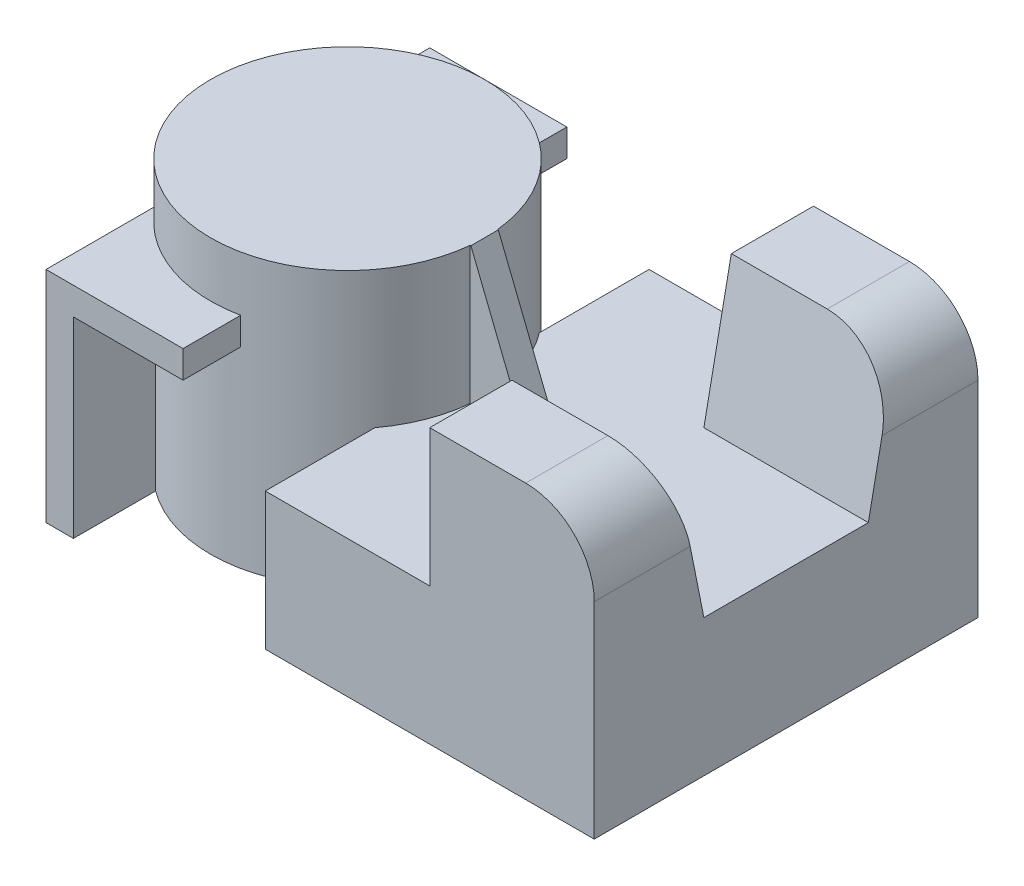
ISO-10303-21;
HEADER;
FILE_DESCRIPTION(('STEP AP214'),'2;1');
FILE_NAME('part.step','',(''),(''),'','','');
FILE_SCHEMA(('AUTOMOTIVE_DESIGN { 1 0 10303 214 1 1 1 1 }'));
ENDSEC;
DATA;
#1=APPLICATION_CONTEXT('core data for automotive mechanical design processes');
#2=APPLICATION_PROTOCOL_DEFINITION('international standard','automotive_design',2000,#1);
#3=PRODUCT_CONTEXT('',#1,'mechanical');
#4=PRODUCT('Part','Part','',(#3));
#5=PRODUCT_RELATED_PRODUCT_CATEGORY('part','',(#4));
#6=PRODUCT_DEFINITION_FORMATION('','',#4);
#7=PRODUCT_DEFINITION_CONTEXT('part definition',#1,'design');
#8=PRODUCT_DEFINITION('design','',#6,#7);
#9=PRODUCT_DEFINITION_SHAPE('','',#8);
#10=(LENGTH_UNIT() NAMED_UNIT(*) SI_UNIT(.MILLI.,.METRE.));
#11=(NAMED_UNIT(*) PLANE_ANGLE_UNIT() SI_UNIT($,.RADIAN.));
#12=(NAMED_UNIT(*) SI_UNIT($,.STERADIAN.) SOLID_ANGLE_UNIT());
#13=UNCERTAINTY_MEASURE_WITH_UNIT(LENGTH_MEASURE(1.E-05),#10,'distance_accuracy_value','');
#14=(GEOMETRIC_REPRESENTATION_CONTEXT(3) GLOBAL_UNCERTAINTY_ASSIGNED_CONTEXT((#13)) GLOBAL_UNIT_ASSIGNED_CONTEXT((#10,
#11,#12)) REPRESENTATION_CONTEXT('',''));
#15=CARTESIAN_POINT('',(0.,0.,0.));
#16=DIRECTION('',(0.,0.,1.));
#17=DIRECTION('',(1.,0.,0.));
#18=AXIS2_PLACEMENT_3D('',#15,#16,#17);
#19=CARTESIAN_POINT('',(67.5,37.5,35.));
#20=DIRECTION('',(0.,0.,-1.));
#21=DIRECTION('',(-1.,0.,0.));
#22=AXIS2_PLACEMENT_3D('',#19,#20,#21);
#23=CYLINDRICAL_SURFACE('',#22,12.5);
#24=CARTESIAN_POINT('',(67.5,37.5,17.5));
#25=DIRECTION('',(0.,0.196116135138184,-0.98058067569092));
#26=DIRECTION('',(0.,-0.98058067569092,-0.196116135138184));
#27=AXIS2_PLACEMENT_3D('',#24,#25,#26);
#28=ELLIPSE('',#27,12.747548783982,12.5);
#29=CARTESIAN_POINT('',(80.,37.5,17.5));
#30=VERTEX_POINT('',#29);
#31=CARTESIAN_POINT('',(67.5,50.,20.));
#32=VERTEX_POINT('',#31);
#33=EDGE_CURVE('E255',#30,#32,#28,.F.);
#34=ORIENTED_EDGE('',*,*,#33,.T.);
#35=DIRECTION('',(0.,0.,-1.));
#36=VECTOR('',#35,1.);
#37=CARTESIAN_POINT('',(67.5,50.,35.));
#38=LINE('',#37,#36);
#39=CARTESIAN_POINT('',(67.5,50.,35.));
#40=VERTEX_POINT('',#39);
#41=EDGE_CURVE('E269',#40,#32,#38,.T.);
#42=ORIENTED_EDGE('',*,*,#41,.F.);
#43=CARTESIAN_POINT('',(67.5,37.5,35.));
#44=DIRECTION('',(0.,0.,1.));
#45=DIRECTION('',(1.,0.,0.));
#46=AXIS2_PLACEMENT_3D('',#43,#44,#45);
#47=CIRCLE('',#46,12.5);
#48=CARTESIAN_POINT('',(80.,37.5,35.));
#49=VERTEX_POINT('',#48);
#50=EDGE_CURVE('E419',#49,#40,#47,.T.);
#51=ORIENTED_EDGE('',*,*,#50,.F.);
#52=DIRECTION('',(0.,0.,-1.));
#53=VECTOR('',#52,1.);
#54=CARTESIAN_POINT('',(80.,37.5,35.));
#55=LINE('',#54,#53);
#56=EDGE_CURVE('E273',#49,#30,#55,.T.);
#57=ORIENTED_EDGE('',*,*,#56,.T.);
#58=EDGE_LOOP('',(#34,#42,#51,#57));
#59=FACE_BOUND('',#58,.T.);
#60=ADVANCED_FACE('F37',(#59),#23,.T.);
#61=CARTESIAN_POINT('',(50.,50.,35.));
#62=DIRECTION('',(0.,-1.,0.));
#63=DIRECTION('',(1.,0.,0.));
#64=AXIS2_PLACEMENT_3D('',#61,#62,#63);
#65=PLANE('',#64);
#66=DIRECTION('',(1.,0.,0.));
#67=VECTOR('',#66,1.);
#68=CARTESIAN_POINT('',(-25.001,50.,20.));
#69=LINE('',#68,#67);
#70=CARTESIAN_POINT('',(50.,50.,20.));
#71=VERTEX_POINT('',#70);
#72=EDGE_CURVE('E559',#71,#32,#69,.T.);
#73=ORIENTED_EDGE('',*,*,#72,.F.);
#74=DIRECTION('',(0.,0.,-1.));
#75=VECTOR('',#74,1.);
#76=CARTESIAN_POINT('',(50.,50.,35.));
#77=LINE('',#76,#75);
#78=CARTESIAN_POINT('',(50.,50.,35.));
#79=VERTEX_POINT('',#78);
#80=EDGE_CURVE('E254',#79,#71,#77,.T.);
#81=ORIENTED_EDGE('',*,*,#80,.F.);
#82=DIRECTION('',(-1.,0.,0.));
#83=VECTOR('',#82,1.);
#84=CARTESIAN_POINT('',(50.,50.,35.));
#85=LINE('',#84,#83);
#86=EDGE_CURVE('E421',#40,#79,#85,.T.);
#87=ORIENTED_EDGE('',*,*,#86,.F.);
#88=ORIENTED_EDGE('',*,*,#41,.T.);
#89=EDGE_LOOP('',(#73,#81,#87,#88));
#90=FACE_BOUND('',#89,.T.);
#91=ADVANCED_FACE('F532',(#90),#65,.F.);
#92=CARTESIAN_POINT('',(50.,25.,35.));
#93=DIRECTION('',(1.,0.,0.));
#94=DIRECTION('',(0.,0.,-1.));
#95=AXIS2_PLACEMENT_3D('',#92,#93,#94);
#96=PLANE('',#95);
#97=DIRECTION('',(0.,-0.98058067569092,-0.196116135138184));
#98=VECTOR('',#97,1.);
#99=CARTESIAN_POINT('',(50.,25.,15.));
#100=LINE('',#99,#98);
#101=CARTESIAN_POINT('',(50.,25.,15.));
#102=VERTEX_POINT('',#101);
#103=EDGE_CURVE('E236',#71,#102,#100,.T.);
#104=ORIENTED_EDGE('',*,*,#103,.T.);
#105=DIRECTION('',(0.,0.,-1.));
#106=VECTOR('',#105,1.);
#107=CARTESIAN_POINT('',(50.,25.,35.));
#108=LINE('',#107,#106);
#109=CARTESIAN_POINT('',(50.,25.,35.));
#110=VERTEX_POINT('',#109);
#111=EDGE_CURVE('E251',#110,#102,#108,.T.);
#112=ORIENTED_EDGE('',*,*,#111,.F.);
#113=DIRECTION('',(0.,-1.,0.));
#114=VECTOR('',#113,1.);
#115=CARTESIAN_POINT('',(50.,25.,35.));
#116=LINE('',#115,#114);
#117=EDGE_CURVE('E423',#79,#110,#116,.T.);
#118=ORIENTED_EDGE('',*,*,#117,.F.);
#119=ORIENTED_EDGE('',*,*,#80,.T.);
#120=EDGE_LOOP('',(#104,#112,#118,#119));
#121=FACE_BOUND('',#120,.T.);
#122=ADVANCED_FACE('F249',(#121),#96,.F.);
#123=CARTESIAN_POINT('',(0.,50.,0.));
#124=DIRECTION('',(0.,-1.,0.));
#125=DIRECTION('',(0.,0.,-1.));
#126=AXIS2_PLACEMENT_3D('',#123,#124,#125);
#127=CYLINDRICAL_SURFACE('',#126,25.);
#128=DIRECTION('',(0.,-1.,0.));
#129=VECTOR('',#128,1.);
#130=CARTESIAN_POINT('',(24.8746859276655,50.,2.5));
#131=LINE('',#130,#129);
#132=CARTESIAN_POINT('',(24.8746859276655,25.,2.5));
#133=VERTEX_POINT('',#132);
#134=CARTESIAN_POINT('',(24.8746859276655,50.,2.5));
#135=VERTEX_POINT('',#134);
#136=EDGE_CURVE('E394',#133,#135,#131,.F.);
#137=ORIENTED_EDGE('',*,*,#136,.T.);
#138=CARTESIAN_POINT('',(0.,50.,0.));
#139=DIRECTION('',(0.,1.,0.));
#140=DIRECTION('',(0.,0.,1.));
#141=AXIS2_PLACEMENT_3D('',#138,#139,#140);
#142=CIRCLE('',#141,25.);
#143=CARTESIAN_POINT('',(24.8746859276655,50.,-2.5));
#144=VERTEX_POINT('',#143);
#145=EDGE_CURVE('E60',#144,#135,#142,.T.);
#146=ORIENTED_EDGE('',*,*,#145,.F.);
#147=DIRECTION('',(0.,-1.,0.));
#148=VECTOR('',#147,1.);
#149=CARTESIAN_POINT('',(24.8746859276655,50.,-2.5));
#150=LINE('',#149,#148);
#151=CARTESIAN_POINT('',(24.8746859276655,25.,-2.5));
#152=VERTEX_POINT('',#151);
#153=EDGE_CURVE('E400',#152,#144,#150,.F.);
#154=ORIENTED_EDGE('',*,*,#153,.F.);
#155=CARTESIAN_POINT('',(0.,25.,0.));
#156=DIRECTION('',(0.,-1.,0.));
#157=DIRECTION('',(0.,0.,-1.));
#158=AXIS2_PLACEMENT_3D('',#155,#156,#157);
#159=CIRCLE('',#158,25.);
#160=CARTESIAN_POINT('',(20.,25.,-15.));
#161=VERTEX_POINT('',#160);
#162=EDGE_CURVE('E377',#161,#152,#159,.T.);
#163=ORIENTED_EDGE('',*,*,#162,.F.);
#164=DIRECTION('',(0.,-1.,0.));
#165=VECTOR('',#164,1.);
#166=CARTESIAN_POINT('',(20.,50.,-15.));
#167=LINE('',#166,#165);
#168=CARTESIAN_POINT('',(20.,0.,-15.));
#169=VERTEX_POINT('',#168);
#170=EDGE_CURVE('E279',#169,#161,#167,.F.);
#171=ORIENTED_EDGE('',*,*,#170,.F.);
#172=CARTESIAN_POINT('',(0.,0.,0.));
#173=DIRECTION('',(0.,1.,0.));
#174=DIRECTION('',(0.,0.,1.));
#175=AXIS2_PLACEMENT_3D('',#172,#173,#174);
#176=CIRCLE('',#175,25.);
#177=CARTESIAN_POINT('',(-15.,0.,-20.));
#178=VERTEX_POINT('',#177);
#179=EDGE_CURVE('E376',#169,#178,#176,.T.);
#180=ORIENTED_EDGE('',*,*,#179,.T.);
#181=DIRECTION('',(0.,-1.,0.));
#182=VECTOR('',#181,1.);
#183=CARTESIAN_POINT('',(-15.,50.,-20.));
#184=LINE('',#183,#182);
#185=CARTESIAN_POINT('',(-15.,35.,-20.));
#186=VERTEX_POINT('',#185);
#187=EDGE_CURVE('E296',#178,#186,#184,.F.);
#188=ORIENTED_EDGE('',*,*,#187,.T.);
#189=CARTESIAN_POINT('',(0.,35.,0.));
#190=DIRECTION('',(0.,1.,0.));
#191=DIRECTION('',(0.,0.,1.));
#192=AXIS2_PLACEMENT_3D('',#189,#190,#191);
#193=CIRCLE('',#192,25.);
#194=CARTESIAN_POINT('',(5.,35.,-24.4948974278318));
#195=VERTEX_POINT('',#194);
#196=EDGE_CURVE('E294',#186,#195,#193,.F.);
#197=ORIENTED_EDGE('',*,*,#196,.T.);
#198=DIRECTION('',(0.,-1.,0.));
#199=VECTOR('',#198,1.);
#200=CARTESIAN_POINT('',(5.,50.,-24.4948974278318));
#201=LINE('',#200,#199);
#202=CARTESIAN_POINT('',(5.,40.,-24.4948974278318));
#203=VERTEX_POINT('',#202);
#204=EDGE_CURVE('E292',#195,#203,#201,.F.);
#205=ORIENTED_EDGE('',*,*,#204,.T.);
#206=CARTESIAN_POINT('',(0.,40.,0.));
#207=DIRECTION('',(0.,-1.,0.));
#208=DIRECTION('',(0.,0.,-1.));
#209=AXIS2_PLACEMENT_3D('',#206,#207,#208);
#210=CIRCLE('',#209,25.);
#211=CARTESIAN_POINT('',(-20.,40.,-15.));
#212=VERTEX_POINT('',#211);
#213=EDGE_CURVE('E289',#203,#212,#210,.F.);
#214=ORIENTED_EDGE('',*,*,#213,.T.);
#215=DIRECTION('',(0.,-1.,0.));
#216=VECTOR('',#215,1.);
#217=CARTESIAN_POINT('',(-20.,50.,-15.));
#218=LINE('',#217,#216);
#219=CARTESIAN_POINT('',(-20.,0.,-15.));
#220=VERTEX_POINT('',#219);
#221=EDGE_CURVE('E286',#212,#220,#218,.T.);
#222=ORIENTED_EDGE('',*,*,#221,.T.);
#223=CARTESIAN_POINT('',(-20.,0.,15.));
#224=VERTEX_POINT('',#223);
#225=EDGE_CURVE('E330',#220,#224,#176,.T.);
#226=ORIENTED_EDGE('',*,*,#225,.T.);
#227=DIRECTION('',(0.,-1.,0.));
#228=VECTOR('',#227,1.);
#229=CARTESIAN_POINT('',(-20.,50.,15.));
#230=LINE('',#229,#228);
#231=CARTESIAN_POINT('',(-20.,40.,15.));
#232=VERTEX_POINT('',#231);
#233=EDGE_CURVE('E349',#232,#224,#230,.T.);
#234=ORIENTED_EDGE('',*,*,#233,.F.);
#235=CARTESIAN_POINT('',(0.,40.,0.));
#236=DIRECTION('',(0.,1.,0.));
#237=DIRECTION('',(0.,0.,1.));
#238=AXIS2_PLACEMENT_3D('',#235,#236,#237);
#239=CIRCLE('',#238,25.);
#240=CARTESIAN_POINT('',(5.,40.,24.4948974278318));
#241=VERTEX_POINT('',#240);
#242=EDGE_CURVE('E353',#241,#232,#239,.F.);
#243=ORIENTED_EDGE('',*,*,#242,.F.);
#244=DIRECTION('',(0.,-1.,0.));
#245=VECTOR('',#244,1.);
#246=CARTESIAN_POINT('',(5.,50.,24.4948974278318));
#247=LINE('',#246,#245);
#248=CARTESIAN_POINT('',(5.,35.,24.4948974278318));
#249=VERTEX_POINT('',#248);
#250=EDGE_CURVE('E356',#249,#241,#247,.F.);
#251=ORIENTED_EDGE('',*,*,#250,.F.);
#252=CARTESIAN_POINT('',(0.,35.,0.));
#253=DIRECTION('',(0.,-1.,0.));
#254=DIRECTION('',(0.,0.,-1.));
#255=AXIS2_PLACEMENT_3D('',#252,#253,#254);
#256=CIRCLE('',#255,25.);
#257=CARTESIAN_POINT('',(-15.,35.,20.));
#258=VERTEX_POINT('',#257);
#259=EDGE_CURVE('E359',#258,#249,#256,.F.);
#260=ORIENTED_EDGE('',*,*,#259,.F.);
#261=DIRECTION('',(0.,-1.,0.));
#262=VECTOR('',#261,1.);
#263=CARTESIAN_POINT('',(-15.,50.,20.));
#264=LINE('',#263,#262);
#265=CARTESIAN_POINT('',(-15.,0.,20.));
#266=VERTEX_POINT('',#265);
#267=EDGE_CURVE('E298',#266,#258,#264,.F.);
#268=ORIENTED_EDGE('',*,*,#267,.F.);
#269=CARTESIAN_POINT('',(20.,0.,15.));
#270=VERTEX_POINT('',#269);
#271=EDGE_CURVE('E374',#266,#270,#176,.T.);
#272=ORIENTED_EDGE('',*,*,#271,.T.);
#273=DIRECTION('',(0.,-1.,0.));
#274=VECTOR('',#273,1.);
#275=CARTESIAN_POINT('',(20.,50.,15.));
#276=LINE('',#275,#274);
#277=CARTESIAN_POINT('',(20.,25.,15.));
#278=VERTEX_POINT('',#277);
#279=EDGE_CURVE('E282',#278,#270,#276,.T.);
#280=ORIENTED_EDGE('',*,*,#279,.F.);
#281=EDGE_CURVE('E373',#133,#278,#159,.T.);
#282=ORIENTED_EDGE('',*,*,#281,.F.);
#283=EDGE_LOOP('',(#137,#146,#154,#163,#171,#180,#188,#197,#205,#214,#222,#226,#234,#243,#251,
#260,#268,#272,#280,#282));
#284=FACE_BOUND('',#283,.T.);
#285=ADVANCED_FACE('F39',(#284),#127,.T.);
#286=CARTESIAN_POINT('',(0.,50.,0.));
#287=DIRECTION('',(0.,1.,0.));
#288=DIRECTION('',(0.,0.,1.));
#289=AXIS2_PLACEMENT_3D('',#286,#287,#288);
#290=PLANE('',#289);
#291=ORIENTED_EDGE('',*,*,#145,.T.);
#292=DIRECTION('',(1.,0.,0.));
#293=VECTOR('',#292,1.);
#294=CARTESIAN_POINT('',(27.5,50.,2.5));
#295=LINE('',#294,#293);
#296=CARTESIAN_POINT('',(25.,50.,2.5));
#297=VERTEX_POINT('',#296);
#298=EDGE_CURVE('E398',#297,#135,#295,.F.);
#299=ORIENTED_EDGE('',*,*,#298,.F.);
#300=DIRECTION('',(0.,0.,1.));
#301=VECTOR('',#300,1.);
#302=CARTESIAN_POINT('',(25.,50.,0.));
#303=LINE('',#302,#301);
#304=CARTESIAN_POINT('',(25.,50.,-2.5));
#305=VERTEX_POINT('',#304);
#306=EDGE_CURVE('E397',#305,#297,#303,.T.);
#307=ORIENTED_EDGE('',*,*,#306,.F.);
#308=DIRECTION('',(1.,0.,0.));
#309=VECTOR('',#308,1.);
#310=CARTESIAN_POINT('',(27.5,50.,-2.5));
#311=LINE('',#310,#309);
#312=EDGE_CURVE('E406',#305,#144,#311,.F.);
#313=ORIENTED_EDGE('',*,*,#312,.T.);
#314=EDGE_LOOP('',(#291,#299,#307,#313));
#315=FACE_BOUND('',#314,.T.);
#316=ADVANCED_FACE('F580',(#315),#290,.T.);
#317=CARTESIAN_POINT('',(0.,0.,0.));
#318=DIRECTION('',(0.,1.,0.));
#319=DIRECTION('',(0.,0.,1.));
#320=AXIS2_PLACEMENT_3D('',#317,#318,#319);
#321=PLANE('',#320);
#322=DIRECTION('',(0.,0.,1.));
#323=VECTOR('',#322,1.);
#324=CARTESIAN_POINT('',(-20.,0.,-25.001));
#325=LINE('',#324,#323);
#326=CARTESIAN_POINT('',(-20.,0.,35.));
#327=VERTEX_POINT('',#326);
#328=EDGE_CURVE('E351',#224,#327,#325,.T.);
#329=ORIENTED_EDGE('',*,*,#328,.F.);
#330=ORIENTED_EDGE('',*,*,#225,.F.);
#331=DIRECTION('',(0.,0.,-1.));
#332=VECTOR('',#331,1.);
#333=CARTESIAN_POINT('',(-20.,0.,35.001));
#334=LINE('',#333,#332);
#335=CARTESIAN_POINT('',(-20.,0.,-35.));
#336=VERTEX_POINT('',#335);
#337=EDGE_CURVE('E324',#220,#336,#334,.T.);
#338=ORIENTED_EDGE('',*,*,#337,.T.);
#339=DIRECTION('',(1.,0.,0.));
#340=VECTOR('',#339,1.);
#341=CARTESIAN_POINT('',(-20.,0.,-35.));
#342=LINE('',#341,#340);
#343=CARTESIAN_POINT('',(-15.,0.,-35.));
#344=VERTEX_POINT('',#343);
#345=EDGE_CURVE('E301',#336,#344,#342,.T.);
#346=ORIENTED_EDGE('',*,*,#345,.T.);
#347=DIRECTION('',(0.,0.,-1.));
#348=VECTOR('',#347,1.);
#349=CARTESIAN_POINT('',(-15.,0.,35.001));
#350=LINE('',#349,#348);
#351=EDGE_CURVE('E316',#178,#344,#350,.T.);
#352=ORIENTED_EDGE('',*,*,#351,.F.);
#353=ORIENTED_EDGE('',*,*,#179,.F.);
#354=DIRECTION('',(0.,0.,-1.));
#355=VECTOR('',#354,1.);
#356=CARTESIAN_POINT('',(20.,0.,35.));
#357=LINE('',#356,#355);
#358=CARTESIAN_POINT('',(20.,0.,-35.));
#359=VERTEX_POINT('',#358);
#360=EDGE_CURVE('E428',#169,#359,#357,.T.);
#361=ORIENTED_EDGE('',*,*,#360,.T.);
#362=DIRECTION('',(1.,0.,0.));
#363=VECTOR('',#362,1.);
#364=CARTESIAN_POINT('',(20.,0.,-35.));
#365=LINE('',#364,#363);
#366=CARTESIAN_POINT('',(80.,0.,-35.));
#367=VERTEX_POINT('',#366);
#368=EDGE_CURVE('E412',#359,#367,#365,.T.);
#369=ORIENTED_EDGE('',*,*,#368,.T.);
#370=DIRECTION('',(0.,0.,-1.));
#371=VECTOR('',#370,1.);
#372=CARTESIAN_POINT('',(80.,0.,35.));
#373=LINE('',#372,#371);
#374=CARTESIAN_POINT('',(80.,0.,35.));
#375=VERTEX_POINT('',#374);
#376=EDGE_CURVE('E276',#375,#367,#373,.T.);
#377=ORIENTED_EDGE('',*,*,#376,.F.);
#378=DIRECTION('',(1.,0.,0.));
#379=VECTOR('',#378,1.);
#380=CARTESIAN_POINT('',(20.,0.,35.));
#381=LINE('',#380,#379);
#382=CARTESIAN_POINT('',(20.,0.,35.));
#383=VERTEX_POINT('',#382);
#384=EDGE_CURVE('E413',#383,#375,#381,.T.);
#385=ORIENTED_EDGE('',*,*,#384,.F.);
#386=EDGE_CURVE('E447',#383,#270,#357,.T.);
#387=ORIENTED_EDGE('',*,*,#386,.T.);
#388=ORIENTED_EDGE('',*,*,#271,.F.);
#389=DIRECTION('',(0.,0.,1.));
#390=VECTOR('',#389,1.);
#391=CARTESIAN_POINT('',(-15.,0.,-25.001));
#392=LINE('',#391,#390);
#393=CARTESIAN_POINT('',(-15.,0.,35.));
#394=VERTEX_POINT('',#393);
#395=EDGE_CURVE('E347',#266,#394,#392,.T.);
#396=ORIENTED_EDGE('',*,*,#395,.T.);
#397=DIRECTION('',(1.,0.,0.));
#398=VECTOR('',#397,1.);
#399=CARTESIAN_POINT('',(-20.,0.,35.));
#400=LINE('',#399,#398);
#401=EDGE_CURVE('E327',#327,#394,#400,.T.);
#402=ORIENTED_EDGE('',*,*,#401,.F.);
#403=EDGE_LOOP('',(#329,#330,#338,#346,#352,#353,#361,#369,#377,#385,#387,#388,#396,#402));
#404=FACE_BOUND('',#403,.T.);
#405=ADVANCED_FACE('F456',(#404),#321,.F.);
#406=CARTESIAN_POINT('',(-15.,0.,-25.001));
#407=DIRECTION('',(1.,0.,0.));
#408=DIRECTION('',(0.,0.,-1.));
#409=AXIS2_PLACEMENT_3D('',#406,#407,#408);
#410=PLANE('',#409);
#411=ORIENTED_EDGE('',*,*,#395,.F.);
#412=ORIENTED_EDGE('',*,*,#267,.T.);
#413=DIRECTION('',(0.,0.,1.));
#414=VECTOR('',#413,1.);
#415=CARTESIAN_POINT('',(-15.,35.,-25.001));
#416=LINE('',#415,#414);
#417=CARTESIAN_POINT('',(-15.,35.,35.));
#418=VERTEX_POINT('',#417);
#419=EDGE_CURVE('E350',#258,#418,#416,.T.);
#420=ORIENTED_EDGE('',*,*,#419,.T.);
#421=DIRECTION('',(0.,1.,0.));
#422=VECTOR('',#421,1.);
#423=CARTESIAN_POINT('',(-15.,0.,35.));
#424=LINE('',#423,#422);
#425=EDGE_CURVE('E343',#394,#418,#424,.T.);
#426=ORIENTED_EDGE('',*,*,#425,.F.);
#427=EDGE_LOOP('',(#411,#412,#420,#426));
#428=FACE_BOUND('',#427,.T.);
#429=ADVANCED_FACE('F485',(#428),#410,.T.);
#430=CARTESIAN_POINT('',(-20.,0.,-25.001));
#431=DIRECTION('',(-1.,0.,0.));
#432=DIRECTION('',(0.,-1.,0.));
#433=AXIS2_PLACEMENT_3D('',#430,#431,#432);
#434=PLANE('',#433);
#435=DIRECTION('',(0.,0.,1.));
#436=VECTOR('',#435,1.);
#437=CARTESIAN_POINT('',(-20.,40.,-25.001));
#438=LINE('',#437,#436);
#439=CARTESIAN_POINT('',(-20.,40.,35.));
#440=VERTEX_POINT('',#439);
#441=EDGE_CURVE('E354',#232,#440,#438,.T.);
#442=ORIENTED_EDGE('',*,*,#441,.F.);
#443=ORIENTED_EDGE('',*,*,#233,.T.);
#444=ORIENTED_EDGE('',*,*,#328,.T.);
#445=DIRECTION('',(0.,-1.,0.));
#446=VECTOR('',#445,1.);
#447=CARTESIAN_POINT('',(-20.,0.,35.));
#448=LINE('',#447,#446);
#449=EDGE_CURVE('E331',#440,#327,#448,.T.);
#450=ORIENTED_EDGE('',*,*,#449,.F.);
#451=EDGE_LOOP('',(#442,#443,#444,#450));
#452=FACE_BOUND('',#451,.T.);
#453=ADVANCED_FACE('F494',(#452),#434,.T.);
#454=CARTESIAN_POINT('',(-20.,40.,-25.001));
#455=DIRECTION('',(0.,1.,0.));
#456=DIRECTION('',(0.,0.,1.));
#457=AXIS2_PLACEMENT_3D('',#454,#455,#456);
#458=PLANE('',#457);
#459=DIRECTION('',(0.,0.,1.));
#460=VECTOR('',#459,1.);
#461=CARTESIAN_POINT('',(5.,40.,-25.001));
#462=LINE('',#461,#460);
#463=CARTESIAN_POINT('',(5.,40.,35.));
#464=VERTEX_POINT('',#463);
#465=EDGE_CURVE('E357',#241,#464,#462,.T.);
#466=ORIENTED_EDGE('',*,*,#465,.F.);
#467=ORIENTED_EDGE('',*,*,#242,.T.);
#468=ORIENTED_EDGE('',*,*,#441,.T.);
#469=DIRECTION('',(-1.,0.,0.));
#470=VECTOR('',#469,1.);
#471=CARTESIAN_POINT('',(-20.,40.,35.));
#472=LINE('',#471,#470);
#473=EDGE_CURVE('E334',#464,#440,#472,.T.);
#474=ORIENTED_EDGE('',*,*,#473,.F.);
#475=EDGE_LOOP('',(#466,#467,#468,#474));
#476=FACE_BOUND('',#475,.T.);
#477=ADVANCED_FACE('F595',(#476),#458,.T.);
#478=CARTESIAN_POINT('',(5.,40.,-25.001));
#479=DIRECTION('',(1.,0.,0.));
#480=DIRECTION('',(0.,1.,0.));
#481=AXIS2_PLACEMENT_3D('',#478,#479,#480);
#482=PLANE('',#481);
#483=DIRECTION('',(0.,0.,1.));
#484=VECTOR('',#483,1.);
#485=CARTESIAN_POINT('',(5.,35.,-25.001));
#486=LINE('',#485,#484);
#487=CARTESIAN_POINT('',(5.,35.,35.));
#488=VERTEX_POINT('',#487);
#489=EDGE_CURVE('E346',#249,#488,#486,.T.);
#490=ORIENTED_EDGE('',*,*,#489,.F.);
#491=ORIENTED_EDGE('',*,*,#250,.T.);
#492=ORIENTED_EDGE('',*,*,#465,.T.);
#493=DIRECTION('',(0.,1.,0.));
#494=VECTOR('',#493,1.);
#495=CARTESIAN_POINT('',(5.,40.,35.));
#496=LINE('',#495,#494);
#497=EDGE_CURVE('E337',#488,#464,#496,.T.);
#498=ORIENTED_EDGE('',*,*,#497,.F.);
#499=EDGE_LOOP('',(#490,#491,#492,#498));
#500=FACE_BOUND('',#499,.T.);
#501=ADVANCED_FACE('F591',(#500),#482,.T.);
#502=CARTESIAN_POINT('',(-15.,35.,-25.001));
#503=DIRECTION('',(0.,-1.,0.));
#504=DIRECTION('',(0.,0.,-1.));
#505=AXIS2_PLACEMENT_3D('',#502,#503,#504);
#506=PLANE('',#505);
#507=ORIENTED_EDGE('',*,*,#419,.F.);
#508=ORIENTED_EDGE('',*,*,#259,.T.);
#509=ORIENTED_EDGE('',*,*,#489,.T.);
#510=DIRECTION('',(1.,0.,0.));
#511=VECTOR('',#510,1.);
#512=CARTESIAN_POINT('',(-15.,35.,35.));
#513=LINE('',#512,#511);
#514=EDGE_CURVE('E340',#418,#488,#513,.T.);
#515=ORIENTED_EDGE('',*,*,#514,.F.);
#516=EDGE_LOOP('',(#507,#508,#509,#515));
#517=FACE_BOUND('',#516,.T.);
#518=ADVANCED_FACE('F588',(#517),#506,.T.);
#519=CARTESIAN_POINT('',(0.,0.,35.));
#520=DIRECTION('',(0.,0.,-1.));
#521=DIRECTION('',(-1.,0.,0.));
#522=AXIS2_PLACEMENT_3D('',#519,#520,#521);
#523=PLANE('',#522);
#524=ORIENTED_EDGE('',*,*,#425,.T.);
#525=ORIENTED_EDGE('',*,*,#514,.T.);
#526=ORIENTED_EDGE('',*,*,#497,.T.);
#527=ORIENTED_EDGE('',*,*,#473,.T.);
#528=ORIENTED_EDGE('',*,*,#449,.T.);
#529=ORIENTED_EDGE('',*,*,#401,.T.);
#530=EDGE_LOOP('',(#524,#525,#526,#527,#528,#529));
#531=FACE_BOUND('',#530,.T.);
#532=ADVANCED_FACE('F489',(#531),#523,.F.);
#533=CARTESIAN_POINT('',(0.,0.,-35.));
#534=DIRECTION('',(0.,0.,1.));
#535=DIRECTION('',(-1.,0.,0.));
#536=AXIS2_PLACEMENT_3D('',#533,#534,#535);
#537=PLANE('',#536);
#538=DIRECTION('',(0.,1.,0.));
#539=VECTOR('',#538,1.);
#540=CARTESIAN_POINT('',(-15.,0.,-35.));
#541=LINE('',#540,#539);
#542=CARTESIAN_POINT('',(-15.,35.,-35.));
#543=VERTEX_POINT('',#542);
#544=EDGE_CURVE('E285',#344,#543,#541,.T.);
#545=ORIENTED_EDGE('',*,*,#544,.F.);
#546=ORIENTED_EDGE('',*,*,#345,.F.);
#547=DIRECTION('',(0.,-1.,0.));
#548=VECTOR('',#547,1.);
#549=CARTESIAN_POINT('',(-20.,0.,-35.));
#550=LINE('',#549,#548);
#551=CARTESIAN_POINT('',(-20.,40.,-35.));
#552=VERTEX_POINT('',#551);
#553=EDGE_CURVE('E304',#552,#336,#550,.T.);
#554=ORIENTED_EDGE('',*,*,#553,.F.);
#555=DIRECTION('',(-1.,0.,0.));
#556=VECTOR('',#555,1.);
#557=CARTESIAN_POINT('',(-20.,40.,-35.));
#558=LINE('',#557,#556);
#559=CARTESIAN_POINT('',(5.,40.,-35.));
#560=VERTEX_POINT('',#559);
#561=EDGE_CURVE('E307',#560,#552,#558,.T.);
#562=ORIENTED_EDGE('',*,*,#561,.F.);
#563=DIRECTION('',(0.,1.,0.));
#564=VECTOR('',#563,1.);
#565=CARTESIAN_POINT('',(5.,40.,-35.));
#566=LINE('',#565,#564);
#567=CARTESIAN_POINT('',(5.,35.,-35.));
#568=VERTEX_POINT('',#567);
#569=EDGE_CURVE('E310',#568,#560,#566,.T.);
#570=ORIENTED_EDGE('',*,*,#569,.F.);
#571=DIRECTION('',(1.,0.,0.));
#572=VECTOR('',#571,1.);
#573=CARTESIAN_POINT('',(-15.,35.,-35.));
#574=LINE('',#573,#572);
#575=EDGE_CURVE('E313',#543,#568,#574,.T.);
#576=ORIENTED_EDGE('',*,*,#575,.F.);
#577=EDGE_LOOP('',(#545,#546,#554,#562,#570,#576));
#578=FACE_BOUND('',#577,.T.);
#579=ADVANCED_FACE('F506',(#578),#537,.F.);
#580=CARTESIAN_POINT('',(-20.,0.,35.001));
#581=DIRECTION('',(1.,0.,0.));
#582=DIRECTION('',(0.,1.,0.));
#583=AXIS2_PLACEMENT_3D('',#580,#581,#582);
#584=PLANE('',#583);
#585=ORIENTED_EDGE('',*,*,#221,.F.);
#586=DIRECTION('',(0.,0.,-1.));
#587=VECTOR('',#586,1.);
#588=CARTESIAN_POINT('',(-20.,40.,35.001));
#589=LINE('',#588,#587);
#590=EDGE_CURVE('E322',#212,#552,#589,.T.);
#591=ORIENTED_EDGE('',*,*,#590,.T.);
#592=ORIENTED_EDGE('',*,*,#553,.T.);
#593=ORIENTED_EDGE('',*,*,#337,.F.);
#594=EDGE_LOOP('',(#585,#591,#592,#593));
#595=FACE_BOUND('',#594,.T.);
#596=ADVANCED_FACE('F500',(#595),#584,.F.);
#597=CARTESIAN_POINT('',(-20.,40.,35.001));
#598=DIRECTION('',(0.,-1.,0.));
#599=DIRECTION('',(0.,0.,-1.));
#600=AXIS2_PLACEMENT_3D('',#597,#598,#599);
#601=PLANE('',#600);
#602=ORIENTED_EDGE('',*,*,#213,.F.);
#603=DIRECTION('',(0.,0.,-1.));
#604=VECTOR('',#603,1.);
#605=CARTESIAN_POINT('',(5.,40.,35.001));
#606=LINE('',#605,#604);
#607=EDGE_CURVE('E320',#203,#560,#606,.T.);
#608=ORIENTED_EDGE('',*,*,#607,.T.);
#609=ORIENTED_EDGE('',*,*,#561,.T.);
#610=ORIENTED_EDGE('',*,*,#590,.F.);
#611=EDGE_LOOP('',(#602,#608,#609,#610));
#612=FACE_BOUND('',#611,.T.);
#613=ADVANCED_FACE('F522',(#612),#601,.F.);
#614=CARTESIAN_POINT('',(5.,40.,35.001));
#615=DIRECTION('',(-1.,0.,0.));
#616=DIRECTION('',(0.,-1.,0.));
#617=AXIS2_PLACEMENT_3D('',#614,#615,#616);
#618=PLANE('',#617);
#619=ORIENTED_EDGE('',*,*,#204,.F.);
#620=DIRECTION('',(0.,0.,-1.));
#621=VECTOR('',#620,1.);
#622=CARTESIAN_POINT('',(5.,35.,35.001));
#623=LINE('',#622,#621);
#624=EDGE_CURVE('E318',#195,#568,#623,.T.);
#625=ORIENTED_EDGE('',*,*,#624,.T.);
#626=ORIENTED_EDGE('',*,*,#569,.T.);
#627=ORIENTED_EDGE('',*,*,#607,.F.);
#628=EDGE_LOOP('',(#619,#625,#626,#627));
#629=FACE_BOUND('',#628,.T.);
#630=ADVANCED_FACE('F519',(#629),#618,.F.);
#631=CARTESIAN_POINT('',(-15.,35.,35.001));
#632=DIRECTION('',(0.,1.,0.));
#633=DIRECTION('',(0.,0.,1.));
#634=AXIS2_PLACEMENT_3D('',#631,#632,#633);
#635=PLANE('',#634);
#636=ORIENTED_EDGE('',*,*,#196,.F.);
#637=DIRECTION('',(0.,0.,-1.));
#638=VECTOR('',#637,1.);
#639=CARTESIAN_POINT('',(-15.,35.,35.001));
#640=LINE('',#639,#638);
#641=EDGE_CURVE('E290',#186,#543,#640,.T.);
#642=ORIENTED_EDGE('',*,*,#641,.T.);
#643=ORIENTED_EDGE('',*,*,#575,.T.);
#644=ORIENTED_EDGE('',*,*,#624,.F.);
#645=EDGE_LOOP('',(#636,#642,#643,#644));
#646=FACE_BOUND('',#645,.T.);
#647=ADVANCED_FACE('F516',(#646),#635,.F.);
#648=CARTESIAN_POINT('',(-15.,0.,35.001));
#649=DIRECTION('',(-1.,0.,0.));
#650=DIRECTION('',(0.,0.,1.));
#651=AXIS2_PLACEMENT_3D('',#648,#649,#650);
#652=PLANE('',#651);
#653=ORIENTED_EDGE('',*,*,#187,.F.);
#654=ORIENTED_EDGE('',*,*,#351,.T.);
#655=ORIENTED_EDGE('',*,*,#544,.T.);
#656=ORIENTED_EDGE('',*,*,#641,.F.);
#657=EDGE_LOOP('',(#653,#654,#655,#656));
#658=FACE_BOUND('',#657,.T.);
#659=ADVANCED_FACE('F510',(#658),#652,.F.);
#660=CARTESIAN_POINT('',(20.,0.,35.));
#661=DIRECTION('',(1.,0.,0.));
#662=DIRECTION('',(0.,1.,0.));
#663=AXIS2_PLACEMENT_3D('',#660,#661,#662);
#664=PLANE('',#663);
#665=DIRECTION('',(0.,0.,-1.));
#666=VECTOR('',#665,1.);
#667=CARTESIAN_POINT('',(20.,25.,35.));
#668=LINE('',#667,#666);
#669=CARTESIAN_POINT('',(20.,25.,35.));
#670=VERTEX_POINT('',#669);
#671=EDGE_CURVE('E264',#670,#278,#668,.T.);
#672=ORIENTED_EDGE('',*,*,#671,.T.);
#673=ORIENTED_EDGE('',*,*,#279,.T.);
#674=ORIENTED_EDGE('',*,*,#386,.F.);
#675=DIRECTION('',(0.,-1.,0.));
#676=VECTOR('',#675,1.);
#677=CARTESIAN_POINT('',(20.,0.,35.));
#678=LINE('',#677,#676);
#679=EDGE_CURVE('E426',#670,#383,#678,.T.);
#680=ORIENTED_EDGE('',*,*,#679,.F.);
#681=EDGE_LOOP('',(#672,#673,#674,#680));
#682=FACE_BOUND('',#681,.T.);
#683=ADVANCED_FACE('F478',(#682),#664,.F.);
#684=ORIENTED_EDGE('',*,*,#360,.F.);
#685=ORIENTED_EDGE('',*,*,#170,.T.);
#686=CARTESIAN_POINT('',(20.,25.,-35.));
#687=VERTEX_POINT('',#686);
#688=EDGE_CURVE('E449',#161,#687,#668,.T.);
#689=ORIENTED_EDGE('',*,*,#688,.T.);
#690=DIRECTION('',(0.,-1.,0.));
#691=VECTOR('',#690,1.);
#692=CARTESIAN_POINT('',(20.,0.,-35.));
#693=LINE('',#692,#691);
#694=EDGE_CURVE('E417',#687,#359,#693,.T.);
#695=ORIENTED_EDGE('',*,*,#694,.T.);
#696=EDGE_LOOP('',(#684,#685,#689,#695));
#697=FACE_BOUND('',#696,.T.);
#698=ADVANCED_FACE('F462',(#697),#664,.F.);
#699=CARTESIAN_POINT('',(80.,37.5,35.));
#700=DIRECTION('',(-1.,0.,0.));
#701=DIRECTION('',(0.,0.,1.));
#702=AXIS2_PLACEMENT_3D('',#699,#700,#701);
#703=PLANE('',#702);
#704=CARTESIAN_POINT('',(80.,37.5,-17.5));
#705=VERTEX_POINT('',#704);
#706=CARTESIAN_POINT('',(80.,37.5,-35.));
#707=VERTEX_POINT('',#706);
#708=EDGE_CURVE('E272',#705,#707,#55,.T.);
#709=ORIENTED_EDGE('',*,*,#708,.F.);
#710=DIRECTION('',(0.,0.98058067569092,-0.196116135138184));
#711=VECTOR('',#710,1.);
#712=CARTESIAN_POINT('',(80.,25.,-15.));
#713=LINE('',#712,#711);
#714=CARTESIAN_POINT('',(80.,25.,-15.));
#715=VERTEX_POINT('',#714);
#716=EDGE_CURVE('E563',#715,#705,#713,.T.);
#717=ORIENTED_EDGE('',*,*,#716,.F.);
#718=DIRECTION('',(0.,0.,-1.));
#719=VECTOR('',#718,1.);
#720=CARTESIAN_POINT('',(80.,25.,15.));
#721=LINE('',#720,#719);
#722=CARTESIAN_POINT('',(80.,25.,15.));
#723=VERTEX_POINT('',#722);
#724=EDGE_CURVE('E560',#723,#715,#721,.T.);
#725=ORIENTED_EDGE('',*,*,#724,.F.);
#726=DIRECTION('',(0.,0.98058067569092,0.196116135138184));
#727=VECTOR('',#726,1.);
#728=CARTESIAN_POINT('',(80.,25.,15.));
#729=LINE('',#728,#727);
#730=EDGE_CURVE('E239',#723,#30,#729,.T.);
#731=ORIENTED_EDGE('',*,*,#730,.T.);
#732=ORIENTED_EDGE('',*,*,#56,.F.);
#733=DIRECTION('',(0.,1.,0.));
#734=VECTOR('',#733,1.);
#735=CARTESIAN_POINT('',(80.,37.5,35.));
#736=LINE('',#735,#734);
#737=EDGE_CURVE('E416',#375,#49,#736,.T.);
#738=ORIENTED_EDGE('',*,*,#737,.F.);
#739=ORIENTED_EDGE('',*,*,#376,.T.);
#740=DIRECTION('',(0.,1.,0.));
#741=VECTOR('',#740,1.);
#742=CARTESIAN_POINT('',(80.,37.5,-35.));
#743=LINE('',#742,#741);
#744=EDGE_CURVE('E431',#367,#707,#743,.T.);
#745=ORIENTED_EDGE('',*,*,#744,.T.);
#746=EDGE_LOOP('',(#709,#717,#725,#731,#732,#738,#739,#745));
#747=FACE_BOUND('',#746,.T.);
#748=ADVANCED_FACE('F471',(#747),#703,.F.);
#749=CARTESIAN_POINT('',(67.5,50.,-20.));
#750=VERTEX_POINT('',#749);
#751=CARTESIAN_POINT('',(67.5,50.,-35.));
#752=VERTEX_POINT('',#751);
#753=EDGE_CURVE('E268',#750,#752,#38,.T.);
#754=ORIENTED_EDGE('',*,*,#753,.F.);
#755=CARTESIAN_POINT('',(67.5,37.5,-17.5));
#756=DIRECTION('',(0.,-0.196116135138184,-0.98058067569092));
#757=DIRECTION('',(0.,0.98058067569092,-0.196116135138184));
#758=AXIS2_PLACEMENT_3D('',#755,#756,#757);
#759=ELLIPSE('',#758,12.747548783982,12.5);
#760=EDGE_CURVE('E554',#705,#750,#759,.F.);
#761=ORIENTED_EDGE('',*,*,#760,.F.);
#762=ORIENTED_EDGE('',*,*,#708,.T.);
#763=CARTESIAN_POINT('',(67.5,37.5,-35.));
#764=DIRECTION('',(0.,0.,1.));
#765=DIRECTION('',(1.,0.,0.));
#766=AXIS2_PLACEMENT_3D('',#763,#764,#765);
#767=CIRCLE('',#766,12.5);
#768=EDGE_CURVE('E434',#707,#752,#767,.T.);
#769=ORIENTED_EDGE('',*,*,#768,.T.);
#770=EDGE_LOOP('',(#754,#761,#762,#769));
#771=FACE_BOUND('',#770,.T.);
#772=ADVANCED_FACE('F535',(#771),#23,.T.);
#773=CARTESIAN_POINT('',(50.,50.,-20.));
#774=VERTEX_POINT('',#773);
#775=CARTESIAN_POINT('',(50.,50.,-35.));
#776=VERTEX_POINT('',#775);
#777=EDGE_CURVE('E260',#774,#776,#77,.T.);
#778=ORIENTED_EDGE('',*,*,#777,.F.);
#779=DIRECTION('',(1.,0.,0.));
#780=VECTOR('',#779,1.);
#781=CARTESIAN_POINT('',(-25.001,50.,-20.));
#782=LINE('',#781,#780);
#783=EDGE_CURVE('E558',#774,#750,#782,.T.);
#784=ORIENTED_EDGE('',*,*,#783,.T.);
#785=ORIENTED_EDGE('',*,*,#753,.T.);
#786=DIRECTION('',(-1.,0.,0.));
#787=VECTOR('',#786,1.);
#788=CARTESIAN_POINT('',(50.,50.,-35.));
#789=LINE('',#788,#787);
#790=EDGE_CURVE('E437',#752,#776,#789,.T.);
#791=ORIENTED_EDGE('',*,*,#790,.T.);
#792=EDGE_LOOP('',(#778,#784,#785,#791));
#793=FACE_BOUND('',#792,.T.);
#794=ADVANCED_FACE('F541',(#793),#65,.F.);
#795=CARTESIAN_POINT('',(50.,25.,-15.));
#796=VERTEX_POINT('',#795);
#797=CARTESIAN_POINT('',(50.,25.,-35.));
#798=VERTEX_POINT('',#797);
#799=EDGE_CURVE('E261',#796,#798,#108,.T.);
#800=ORIENTED_EDGE('',*,*,#799,.F.);
#801=DIRECTION('',(0.,-0.98058067569092,0.196116135138184));
#802=VECTOR('',#801,1.);
#803=CARTESIAN_POINT('',(50.,25.,-15.));
#804=LINE('',#803,#802);
#805=EDGE_CURVE('E52',#774,#796,#804,.T.);
#806=ORIENTED_EDGE('',*,*,#805,.F.);
#807=ORIENTED_EDGE('',*,*,#777,.T.);
#808=DIRECTION('',(0.,-1.,0.));
#809=VECTOR('',#808,1.);
#810=CARTESIAN_POINT('',(50.,25.,-35.));
#811=LINE('',#810,#809);
#812=EDGE_CURVE('E440',#776,#798,#811,.T.);
#813=ORIENTED_EDGE('',*,*,#812,.T.);
#814=EDGE_LOOP('',(#800,#806,#807,#813));
#815=FACE_BOUND('',#814,.T.);
#816=ADVANCED_FACE('F550',(#815),#96,.F.);
#817=CARTESIAN_POINT('',(20.,25.,35.));
#818=DIRECTION('',(0.,-1.,0.));
#819=DIRECTION('',(0.,0.,-1.));
#820=AXIS2_PLACEMENT_3D('',#817,#818,#819);
#821=PLANE('',#820);
#822=DIRECTION('',(0.,0.,1.));
#823=VECTOR('',#822,1.);
#824=CARTESIAN_POINT('',(35.,25.,35.));
#825=LINE('',#824,#823);
#826=CARTESIAN_POINT('',(35.,25.,-2.5));
#827=VERTEX_POINT('',#826);
#828=CARTESIAN_POINT('',(35.,25.,2.5));
#829=VERTEX_POINT('',#828);
#830=EDGE_CURVE('E45',#827,#829,#825,.T.);
#831=ORIENTED_EDGE('',*,*,#830,.T.);
#832=DIRECTION('',(-1.,0.,0.));
#833=VECTOR('',#832,1.);
#834=CARTESIAN_POINT('',(20.,25.,2.5));
#835=LINE('',#834,#833);
#836=EDGE_CURVE('E11',#829,#133,#835,.T.);
#837=ORIENTED_EDGE('',*,*,#836,.T.);
#838=ORIENTED_EDGE('',*,*,#281,.T.);
#839=ORIENTED_EDGE('',*,*,#671,.F.);
#840=DIRECTION('',(-1.,0.,0.));
#841=VECTOR('',#840,1.);
#842=CARTESIAN_POINT('',(20.,25.,35.));
#843=LINE('',#842,#841);
#844=EDGE_CURVE('E259',#110,#670,#843,.T.);
#845=ORIENTED_EDGE('',*,*,#844,.F.);
#846=ORIENTED_EDGE('',*,*,#111,.T.);
#847=DIRECTION('',(1.,0.,0.));
#848=VECTOR('',#847,1.);
#849=CARTESIAN_POINT('',(-25.001,25.,15.));
#850=LINE('',#849,#848);
#851=EDGE_CURVE('E233',#102,#723,#850,.T.);
#852=ORIENTED_EDGE('',*,*,#851,.T.);
#853=ORIENTED_EDGE('',*,*,#724,.T.);
#854=DIRECTION('',(1.,0.,0.));
#855=VECTOR('',#854,1.);
#856=CARTESIAN_POINT('',(-25.001,25.,-15.));
#857=LINE('',#856,#855);
#858=EDGE_CURVE('E244',#796,#715,#857,.T.);
#859=ORIENTED_EDGE('',*,*,#858,.F.);
#860=ORIENTED_EDGE('',*,*,#799,.T.);
#861=DIRECTION('',(-1.,0.,0.));
#862=VECTOR('',#861,1.);
#863=CARTESIAN_POINT('',(20.,25.,-35.));
#864=LINE('',#863,#862);
#865=EDGE_CURVE('E443',#798,#687,#864,.T.);
#866=ORIENTED_EDGE('',*,*,#865,.T.);
#867=ORIENTED_EDGE('',*,*,#688,.F.);
#868=ORIENTED_EDGE('',*,*,#162,.T.);
#869=DIRECTION('',(-1.,0.,0.));
#870=VECTOR('',#869,1.);
#871=CARTESIAN_POINT('',(20.,25.,-2.5));
#872=LINE('',#871,#870);
#873=EDGE_CURVE('E379',#827,#152,#872,.T.);
#874=ORIENTED_EDGE('',*,*,#873,.F.);
#875=EDGE_LOOP('',(#831,#837,#838,#839,#845,#846,#852,#853,#859,#860,#866,#867,#868,#874));
#876=FACE_BOUND('',#875,.T.);
#877=ADVANCED_FACE('F257',(#876),#821,.F.);
#878=CARTESIAN_POINT('',(67.5,37.5,35.));
#879=DIRECTION('',(0.,0.,1.));
#880=DIRECTION('',(1.,0.,0.));
#881=AXIS2_PLACEMENT_3D('',#878,#879,#880);
#882=PLANE('',#881);
#883=ORIENTED_EDGE('',*,*,#384,.T.);
#884=ORIENTED_EDGE('',*,*,#737,.T.);
#885=ORIENTED_EDGE('',*,*,#50,.T.);
#886=ORIENTED_EDGE('',*,*,#86,.T.);
#887=ORIENTED_EDGE('',*,*,#117,.T.);
#888=ORIENTED_EDGE('',*,*,#844,.T.);
#889=ORIENTED_EDGE('',*,*,#679,.T.);
#890=EDGE_LOOP('',(#883,#884,#885,#886,#887,#888,#889));
#891=FACE_BOUND('',#890,.T.);
#892=ADVANCED_FACE('F474',(#891),#882,.T.);
#893=CARTESIAN_POINT('',(67.5,37.5,-35.));
#894=DIRECTION('',(0.,0.,1.));
#895=DIRECTION('',(1.,0.,0.));
#896=AXIS2_PLACEMENT_3D('',#893,#894,#895);
#897=PLANE('',#896);
#898=ORIENTED_EDGE('',*,*,#368,.F.);
#899=ORIENTED_EDGE('',*,*,#694,.F.);
#900=ORIENTED_EDGE('',*,*,#865,.F.);
#901=ORIENTED_EDGE('',*,*,#812,.F.);
#902=ORIENTED_EDGE('',*,*,#790,.F.);
#903=ORIENTED_EDGE('',*,*,#768,.F.);
#904=ORIENTED_EDGE('',*,*,#744,.F.);
#905=EDGE_LOOP('',(#898,#899,#900,#901,#902,#903,#904));
#906=FACE_BOUND('',#905,.T.);
#907=ADVANCED_FACE('F466',(#906),#897,.F.);
#908=CARTESIAN_POINT('',(25.,50.,0.));
#909=DIRECTION('',(0.928476690885259,0.371390676354104,0.));
#910=DIRECTION('',(-0.371390676354104,0.928476690885259,0.));
#911=AXIS2_PLACEMENT_3D('',#908,#909,#910);
#912=PLANE('',#911);
#913=ORIENTED_EDGE('',*,*,#830,.F.);
#914=DIRECTION('',(-0.371390676354104,0.928476690885259,0.));
#915=VECTOR('',#914,1.);
#916=CARTESIAN_POINT('',(25.,50.,-2.5));
#917=LINE('',#916,#915);
#918=EDGE_CURVE('E402',#827,#305,#917,.T.);
#919=ORIENTED_EDGE('',*,*,#918,.T.);
#920=ORIENTED_EDGE('',*,*,#306,.T.);
#921=DIRECTION('',(-0.371390676354104,0.928476690885259,0.));
#922=VECTOR('',#921,1.);
#923=CARTESIAN_POINT('',(25.,50.,2.5));
#924=LINE('',#923,#922);
#925=EDGE_CURVE('E392',#829,#297,#924,.T.);
#926=ORIENTED_EDGE('',*,*,#925,.F.);
#927=EDGE_LOOP('',(#913,#919,#920,#926));
#928=FACE_BOUND('',#927,.T.);
#929=ADVANCED_FACE('F395',(#928),#912,.T.);
#930=CARTESIAN_POINT('',(27.5,25.,2.5));
#931=DIRECTION('',(0.,0.,1.));
#932=DIRECTION('',(1.,0.,0.));
#933=AXIS2_PLACEMENT_3D('',#930,#931,#932);
#934=PLANE('',#933);
#935=ORIENTED_EDGE('',*,*,#136,.F.);
#936=ORIENTED_EDGE('',*,*,#836,.F.);
#937=ORIENTED_EDGE('',*,*,#925,.T.);
#938=ORIENTED_EDGE('',*,*,#298,.T.);
#939=EDGE_LOOP('',(#935,#936,#937,#938));
#940=FACE_BOUND('',#939,.T.);
#941=ADVANCED_FACE('F390',(#940),#934,.T.);
#942=CARTESIAN_POINT('',(27.5,25.,-2.5));
#943=DIRECTION('',(0.,0.,1.));
#944=DIRECTION('',(1.,0.,0.));
#945=AXIS2_PLACEMENT_3D('',#942,#943,#944);
#946=PLANE('',#945);
#947=ORIENTED_EDGE('',*,*,#873,.T.);
#948=ORIENTED_EDGE('',*,*,#153,.T.);
#949=ORIENTED_EDGE('',*,*,#312,.F.);
#950=ORIENTED_EDGE('',*,*,#918,.F.);
#951=EDGE_LOOP('',(#947,#948,#949,#950));
#952=FACE_BOUND('',#951,.T.);
#953=ADVANCED_FACE('F578',(#952),#946,.F.);
#954=CARTESIAN_POINT('',(-25.001,25.,-15.));
#955=DIRECTION('',(0.,-0.196116135138184,-0.98058067569092));
#956=DIRECTION('',(0.,0.98058067569092,-0.196116135138184));
#957=AXIS2_PLACEMENT_3D('',#954,#955,#956);
#958=PLANE('',#957);
#959=ORIENTED_EDGE('',*,*,#760,.T.);
#960=ORIENTED_EDGE('',*,*,#783,.F.);
#961=ORIENTED_EDGE('',*,*,#805,.T.);
#962=ORIENTED_EDGE('',*,*,#858,.T.);
#963=ORIENTED_EDGE('',*,*,#716,.T.);
#964=EDGE_LOOP('',(#959,#960,#961,#962,#963));
#965=FACE_BOUND('',#964,.T.);
#966=ADVANCED_FACE('F756',(#965),#958,.F.);
#967=CARTESIAN_POINT('',(-25.001,25.,15.));
#968=DIRECTION('',(0.,0.196116135138184,-0.98058067569092));
#969=DIRECTION('',(0.,0.98058067569092,0.196116135138184));
#970=AXIS2_PLACEMENT_3D('',#967,#968,#969);
#971=PLANE('',#970);
#972=ORIENTED_EDGE('',*,*,#730,.F.);
#973=ORIENTED_EDGE('',*,*,#851,.F.);
#974=ORIENTED_EDGE('',*,*,#103,.F.);
#975=ORIENTED_EDGE('',*,*,#72,.T.);
#976=ORIENTED_EDGE('',*,*,#33,.F.);
#977=EDGE_LOOP('',(#972,#973,#974,#975,#976));
#978=FACE_BOUND('',#977,.T.);
#979=ADVANCED_FACE('F235',(#978),#971,.T.);
#980=CLOSED_SHELL('',(#60,#91,#122,#285,#316,#405,#429,#453,#477,#501,#518,#532,#579,#596,#613,
#630,#647,#659,#683,#698,#748,#772,#794,#816,#877,#892,#907,#929,#941,#953,#966,#979));
#981=MANIFOLD_SOLID_BREP('B2',#980);
#982=ADVANCED_BREP_SHAPE_REPRESENTATION('',(#18,#981),#14);
#983=SHAPE_DEFINITION_REPRESENTATION(#9,#982);
ENDSEC;
END-ISO-10303-21;
